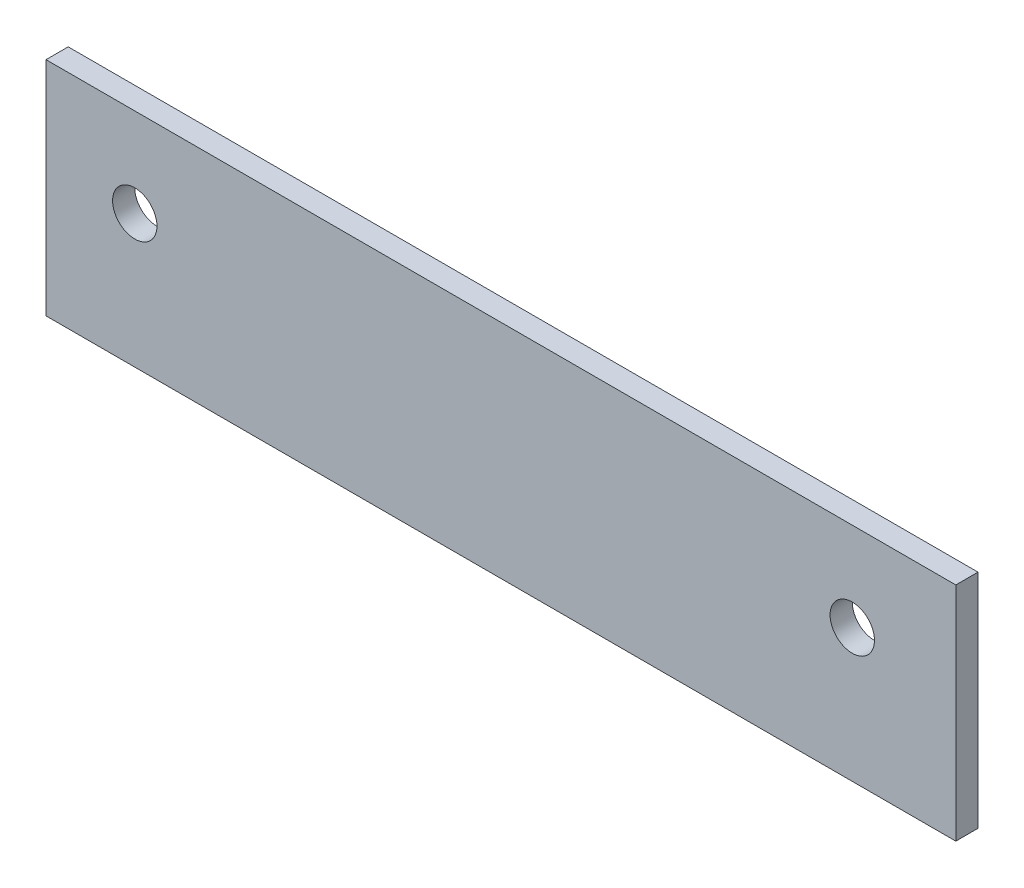
ISO-10303-21;
HEADER;
FILE_DESCRIPTION(('STEP AP214'),'2;1');
FILE_NAME('part.step','',(''),(''),'','','');
FILE_SCHEMA(('AUTOMOTIVE_DESIGN { 1 0 10303 214 1 1 1 1 }'));
ENDSEC;
DATA;
#1=APPLICATION_CONTEXT('core data for automotive mechanical design processes');
#2=APPLICATION_PROTOCOL_DEFINITION('international standard','automotive_design',2000,#1);
#3=PRODUCT_CONTEXT('',#1,'mechanical');
#4=PRODUCT('Part','Part','',(#3));
#5=PRODUCT_RELATED_PRODUCT_CATEGORY('part','',(#4));
#6=PRODUCT_DEFINITION_FORMATION('','',#4);
#7=PRODUCT_DEFINITION_CONTEXT('part definition',#1,'design');
#8=PRODUCT_DEFINITION('design','',#6,#7);
#9=PRODUCT_DEFINITION_SHAPE('','',#8);
#10=(LENGTH_UNIT() NAMED_UNIT(*) SI_UNIT(.MILLI.,.METRE.));
#11=(NAMED_UNIT(*) PLANE_ANGLE_UNIT() SI_UNIT($,.RADIAN.));
#12=(NAMED_UNIT(*) SI_UNIT($,.STERADIAN.) SOLID_ANGLE_UNIT());
#13=UNCERTAINTY_MEASURE_WITH_UNIT(LENGTH_MEASURE(1.E-05),#10,'distance_accuracy_value','');
#14=(GEOMETRIC_REPRESENTATION_CONTEXT(3) GLOBAL_UNCERTAINTY_ASSIGNED_CONTEXT((#13)) GLOBAL_UNIT_ASSIGNED_CONTEXT((#10,
#11,#12)) REPRESENTATION_CONTEXT('',''));
#15=CARTESIAN_POINT('',(0.,0.,0.));
#16=DIRECTION('',(0.,0.,1.));
#17=DIRECTION('',(1.,0.,0.));
#18=AXIS2_PLACEMENT_3D('',#15,#16,#17);
#19=CARTESIAN_POINT('',(-26.736033567068,16.0435244161359,1.5));
#20=DIRECTION('',(1.,0.,0.));
#21=DIRECTION('',(0.,1.,0.));
#22=AXIS2_PLACEMENT_3D('',#19,#20,#21);
#23=PLANE('',#22);
#24=DIRECTION('',(0.,-1.,0.));
#25=VECTOR('',#24,1.);
#26=CARTESIAN_POINT('',(-26.736033567068,16.0435244161359,0.));
#27=LINE('',#26,#25);
#28=CARTESIAN_POINT('',(-26.736033567068,16.0435244161359,0.));
#29=VERTEX_POINT('',#28);
#30=CARTESIAN_POINT('',(-26.736033567068,1.04352441613588,0.));
#31=VERTEX_POINT('',#30);
#32=EDGE_CURVE('E94',#29,#31,#27,.T.);
#33=ORIENTED_EDGE('',*,*,#32,.T.);
#34=DIRECTION('',(0.,0.,-1.));
#35=VECTOR('',#34,1.);
#36=CARTESIAN_POINT('',(-26.736033567068,1.04352441613588,1.5));
#37=LINE('',#36,#35);
#38=CARTESIAN_POINT('',(-26.736033567068,1.04352441613588,1.5));
#39=VERTEX_POINT('',#38);
#40=EDGE_CURVE('E11',#39,#31,#37,.T.);
#41=ORIENTED_EDGE('',*,*,#40,.F.);
#42=DIRECTION('',(0.,-1.,0.));
#43=VECTOR('',#42,1.);
#44=CARTESIAN_POINT('',(-26.736033567068,16.0435244161359,1.5));
#45=LINE('',#44,#43);
#46=CARTESIAN_POINT('',(-26.736033567068,16.0435244161359,1.5));
#47=VERTEX_POINT('',#46);
#48=EDGE_CURVE('E82',#47,#39,#45,.T.);
#49=ORIENTED_EDGE('',*,*,#48,.F.);
#50=DIRECTION('',(0.,0.,-1.));
#51=VECTOR('',#50,1.);
#52=CARTESIAN_POINT('',(-26.736033567068,16.0435244161359,1.5));
#53=LINE('',#52,#51);
#54=EDGE_CURVE('E90',#47,#29,#53,.T.);
#55=ORIENTED_EDGE('',*,*,#54,.T.);
#56=EDGE_LOOP('',(#33,#41,#49,#55));
#57=FACE_BOUND('',#56,.T.);
#58=ADVANCED_FACE('F31',(#57),#23,.F.);
#59=CARTESIAN_POINT('',(-26.736033567068,1.04352441613588,1.5));
#60=DIRECTION('',(0.,1.,0.));
#61=DIRECTION('',(0.,0.,1.));
#62=AXIS2_PLACEMENT_3D('',#59,#60,#61);
#63=PLANE('',#62);
#64=DIRECTION('',(1.,0.,0.));
#65=VECTOR('',#64,1.);
#66=CARTESIAN_POINT('',(-26.736033567068,1.04352441613588,0.));
#67=LINE('',#66,#65);
#68=CARTESIAN_POINT('',(34.763966432932,1.04352441613588,0.));
#69=VERTEX_POINT('',#68);
#70=EDGE_CURVE('E86',#31,#69,#67,.T.);
#71=ORIENTED_EDGE('',*,*,#70,.T.);
#72=DIRECTION('',(0.,0.,-1.));
#73=VECTOR('',#72,1.);
#74=CARTESIAN_POINT('',(34.763966432932,1.04352441613588,1.5));
#75=LINE('',#74,#73);
#76=CARTESIAN_POINT('',(34.763966432932,1.04352441613588,1.5));
#77=VERTEX_POINT('',#76);
#78=EDGE_CURVE('E39',#77,#69,#75,.T.);
#79=ORIENTED_EDGE('',*,*,#78,.F.);
#80=DIRECTION('',(1.,0.,0.));
#81=VECTOR('',#80,1.);
#82=CARTESIAN_POINT('',(-26.736033567068,1.04352441613588,1.5));
#83=LINE('',#82,#81);
#84=EDGE_CURVE('E77',#39,#77,#83,.T.);
#85=ORIENTED_EDGE('',*,*,#84,.F.);
#86=ORIENTED_EDGE('',*,*,#40,.T.);
#87=EDGE_LOOP('',(#71,#79,#85,#86));
#88=FACE_BOUND('',#87,.T.);
#89=ADVANCED_FACE('F85',(#88),#63,.F.);
#90=CARTESIAN_POINT('',(34.763966432932,16.0435244161359,1.5));
#91=DIRECTION('',(-1.,0.,0.));
#92=DIRECTION('',(0.,0.,1.));
#93=AXIS2_PLACEMENT_3D('',#90,#91,#92);
#94=PLANE('',#93);
#95=DIRECTION('',(0.,1.,0.));
#96=VECTOR('',#95,1.);
#97=CARTESIAN_POINT('',(34.763966432932,16.0435244161359,0.));
#98=LINE('',#97,#96);
#99=CARTESIAN_POINT('',(34.763966432932,16.0435244161359,0.));
#100=VERTEX_POINT('',#99);
#101=EDGE_CURVE('E64',#69,#100,#98,.T.);
#102=ORIENTED_EDGE('',*,*,#101,.T.);
#103=DIRECTION('',(0.,0.,-1.));
#104=VECTOR('',#103,1.);
#105=CARTESIAN_POINT('',(34.763966432932,16.0435244161359,1.5));
#106=LINE('',#105,#104);
#107=CARTESIAN_POINT('',(34.763966432932,16.0435244161359,1.5));
#108=VERTEX_POINT('',#107);
#109=EDGE_CURVE('E87',#108,#100,#106,.T.);
#110=ORIENTED_EDGE('',*,*,#109,.F.);
#111=DIRECTION('',(0.,1.,0.));
#112=VECTOR('',#111,1.);
#113=CARTESIAN_POINT('',(34.763966432932,16.0435244161359,1.5));
#114=LINE('',#113,#112);
#115=EDGE_CURVE('E80',#77,#108,#114,.T.);
#116=ORIENTED_EDGE('',*,*,#115,.F.);
#117=ORIENTED_EDGE('',*,*,#78,.T.);
#118=EDGE_LOOP('',(#102,#110,#116,#117));
#119=FACE_BOUND('',#118,.T.);
#120=ADVANCED_FACE('F88',(#119),#94,.F.);
#121=CARTESIAN_POINT('',(-26.736033567068,16.0435244161359,1.5));
#122=DIRECTION('',(0.,-1.,0.));
#123=DIRECTION('',(0.,0.,-1.));
#124=AXIS2_PLACEMENT_3D('',#121,#122,#123);
#125=PLANE('',#124);
#126=DIRECTION('',(-1.,0.,0.));
#127=VECTOR('',#126,1.);
#128=CARTESIAN_POINT('',(-26.736033567068,16.0435244161359,0.));
#129=LINE('',#128,#127);
#130=EDGE_CURVE('E70',#100,#29,#129,.T.);
#131=ORIENTED_EDGE('',*,*,#130,.T.);
#132=ORIENTED_EDGE('',*,*,#54,.F.);
#133=DIRECTION('',(-1.,0.,0.));
#134=VECTOR('',#133,1.);
#135=CARTESIAN_POINT('',(-26.736033567068,16.0435244161359,1.5));
#136=LINE('',#135,#134);
#137=EDGE_CURVE('E47',#108,#47,#136,.T.);
#138=ORIENTED_EDGE('',*,*,#137,.F.);
#139=ORIENTED_EDGE('',*,*,#109,.T.);
#140=EDGE_LOOP('',(#131,#132,#138,#139));
#141=FACE_BOUND('',#140,.T.);
#142=ADVANCED_FACE('F102',(#141),#125,.F.);
#143=CARTESIAN_POINT('',(-26.736033567068,1.04352441613588,1.5));
#144=DIRECTION('',(0.,0.,1.));
#145=DIRECTION('',(1.,0.,0.));
#146=AXIS2_PLACEMENT_3D('',#143,#144,#145);
#147=PLANE('',#146);
#148=CARTESIAN_POINT('',(27.763966432932,10.0435244161359,1.5));
#149=DIRECTION('',(0.,0.,1.));
#150=DIRECTION('',(1.,0.,0.));
#151=AXIS2_PLACEMENT_3D('',#148,#149,#150);
#152=CIRCLE('',#151,1.5);
#153=CARTESIAN_POINT('',(29.263966432932,10.0435244161359,1.5));
#154=VERTEX_POINT('',#153);
#155=EDGE_CURVE('E114',#154,#154,#152,.T.);
#156=ORIENTED_EDGE('',*,*,#155,.F.);
#157=EDGE_LOOP('',(#156));
#158=FACE_BOUND('',#157,.T.);
#159=CARTESIAN_POINT('',(-20.736033567068,10.0435244161359,1.5));
#160=DIRECTION('',(0.,0.,1.));
#161=DIRECTION('',(1.,0.,0.));
#162=AXIS2_PLACEMENT_3D('',#159,#160,#161);
#163=CIRCLE('',#162,1.5);
#164=CARTESIAN_POINT('',(-19.236033567068,10.0435244161359,1.5));
#165=VERTEX_POINT('',#164);
#166=EDGE_CURVE('E108',#165,#165,#163,.T.);
#167=ORIENTED_EDGE('',*,*,#166,.F.);
#168=EDGE_LOOP('',(#167));
#169=FACE_BOUND('',#168,.T.);
#170=ORIENTED_EDGE('',*,*,#48,.T.);
#171=ORIENTED_EDGE('',*,*,#84,.T.);
#172=ORIENTED_EDGE('',*,*,#115,.T.);
#173=ORIENTED_EDGE('',*,*,#137,.T.);
#174=EDGE_LOOP('',(#170,#171,#172,#173));
#175=FACE_BOUND('',#174,.T.);
#176=ADVANCED_FACE('F78',(#158,#169,#175),#147,.T.);
#177=CARTESIAN_POINT('',(-26.736033567068,1.04352441613588,0.));
#178=DIRECTION('',(0.,0.,1.));
#179=DIRECTION('',(1.,0.,0.));
#180=AXIS2_PLACEMENT_3D('',#177,#178,#179);
#181=PLANE('',#180);
#182=CARTESIAN_POINT('',(27.763966432932,10.0435244161359,0.));
#183=DIRECTION('',(0.,0.,1.));
#184=DIRECTION('',(1.,0.,0.));
#185=AXIS2_PLACEMENT_3D('',#182,#183,#184);
#186=CIRCLE('',#185,1.5);
#187=CARTESIAN_POINT('',(29.263966432932,10.0435244161359,0.));
#188=VERTEX_POINT('',#187);
#189=EDGE_CURVE('E111',#188,#188,#186,.T.);
#190=ORIENTED_EDGE('',*,*,#189,.T.);
#191=EDGE_LOOP('',(#190));
#192=FACE_BOUND('',#191,.T.);
#193=CARTESIAN_POINT('',(-20.736033567068,10.0435244161359,0.));
#194=DIRECTION('',(0.,0.,1.));
#195=DIRECTION('',(1.,0.,0.));
#196=AXIS2_PLACEMENT_3D('',#193,#194,#195);
#197=CIRCLE('',#196,1.5);
#198=CARTESIAN_POINT('',(-19.236033567068,10.0435244161359,0.));
#199=VERTEX_POINT('',#198);
#200=EDGE_CURVE('E97',#199,#199,#197,.T.);
#201=ORIENTED_EDGE('',*,*,#200,.T.);
#202=EDGE_LOOP('',(#201));
#203=FACE_BOUND('',#202,.T.);
#204=ORIENTED_EDGE('',*,*,#32,.F.);
#205=ORIENTED_EDGE('',*,*,#130,.F.);
#206=ORIENTED_EDGE('',*,*,#101,.F.);
#207=ORIENTED_EDGE('',*,*,#70,.F.);
#208=EDGE_LOOP('',(#204,#205,#206,#207));
#209=FACE_BOUND('',#208,.T.);
#210=ADVANCED_FACE('F105',(#192,#203,#209),#181,.F.);
#211=CARTESIAN_POINT('',(-20.736033567068,10.0435244161359,0.));
#212=DIRECTION('',(0.,0.,1.));
#213=DIRECTION('',(1.,0.,0.));
#214=AXIS2_PLACEMENT_3D('',#211,#212,#213);
#215=CYLINDRICAL_SURFACE('',#214,1.5);
#216=ORIENTED_EDGE('',*,*,#200,.F.);
#217=EDGE_LOOP('',(#216));
#218=FACE_BOUND('',#217,.T.);
#219=ORIENTED_EDGE('',*,*,#166,.T.);
#220=EDGE_LOOP('',(#219));
#221=FACE_BOUND('',#220,.T.);
#222=ADVANCED_FACE('F125',(#218,#221),#215,.F.);
#223=CARTESIAN_POINT('',(27.763966432932,10.0435244161359,0.));
#224=DIRECTION('',(0.,0.,1.));
#225=DIRECTION('',(1.,0.,0.));
#226=AXIS2_PLACEMENT_3D('',#223,#224,#225);
#227=CYLINDRICAL_SURFACE('',#226,1.5);
#228=ORIENTED_EDGE('',*,*,#189,.F.);
#229=EDGE_LOOP('',(#228));
#230=FACE_BOUND('',#229,.T.);
#231=ORIENTED_EDGE('',*,*,#155,.T.);
#232=EDGE_LOOP('',(#231));
#233=FACE_BOUND('',#232,.T.);
#234=ADVANCED_FACE('F122',(#230,#233),#227,.F.);
#235=CLOSED_SHELL('',(#58,#89,#120,#142,#176,#210,#222,#234));
#236=MANIFOLD_SOLID_BREP('B2',#235);
#237=ADVANCED_BREP_SHAPE_REPRESENTATION('',(#18,#236),#14);
#238=SHAPE_DEFINITION_REPRESENTATION(#9,#237);
ENDSEC;
END-ISO-10303-21;
